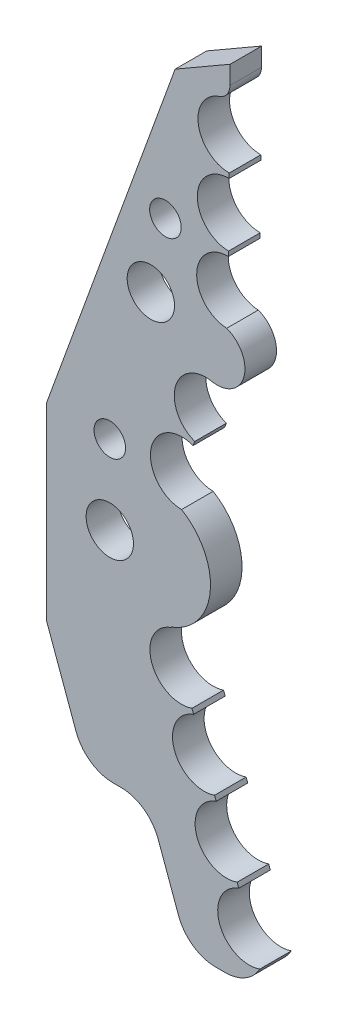
ISO-10303-21;
HEADER;
FILE_DESCRIPTION(('STEP AP214'),'2;1');
FILE_NAME('part.step','',(''),(''),'','','');
FILE_SCHEMA(('AUTOMOTIVE_DESIGN { 1 0 10303 214 1 1 1 1 }'));
ENDSEC;
DATA;
#1=APPLICATION_CONTEXT('core data for automotive mechanical design processes');
#2=APPLICATION_PROTOCOL_DEFINITION('international standard','automotive_design',2000,#1);
#3=PRODUCT_CONTEXT('',#1,'mechanical');
#4=PRODUCT('Part','Part','',(#3));
#5=PRODUCT_RELATED_PRODUCT_CATEGORY('part','',(#4));
#6=PRODUCT_DEFINITION_FORMATION('','',#4);
#7=PRODUCT_DEFINITION_CONTEXT('part definition',#1,'design');
#8=PRODUCT_DEFINITION('design','',#6,#7);
#9=PRODUCT_DEFINITION_SHAPE('','',#8);
#10=(LENGTH_UNIT() NAMED_UNIT(*) SI_UNIT(.MILLI.,.METRE.));
#11=(NAMED_UNIT(*) PLANE_ANGLE_UNIT() SI_UNIT($,.RADIAN.));
#12=(NAMED_UNIT(*) SI_UNIT($,.STERADIAN.) SOLID_ANGLE_UNIT());
#13=UNCERTAINTY_MEASURE_WITH_UNIT(LENGTH_MEASURE(1.E-05),#10,'distance_accuracy_value','');
#14=(GEOMETRIC_REPRESENTATION_CONTEXT(3) GLOBAL_UNCERTAINTY_ASSIGNED_CONTEXT((#13)) GLOBAL_UNIT_ASSIGNED_CONTEXT((#10,
#11,#12)) REPRESENTATION_CONTEXT('',''));
#15=CARTESIAN_POINT('',(0.,0.,0.));
#16=DIRECTION('',(0.,0.,1.));
#17=DIRECTION('',(1.,0.,0.));
#18=AXIS2_PLACEMENT_3D('',#15,#16,#17);
#19=CARTESIAN_POINT('',(7.1643416681253,2.52993402332491,2.));
#20=DIRECTION('',(0.942934851717221,0.332977274625494,0.));
#21=DIRECTION('',(-0.332977274625494,0.942934851717222,0.));
#22=AXIS2_PLACEMENT_3D('',#19,#20,#21);
#23=PLANE('',#22);
#24=DIRECTION('',(0.332977274625494,-0.942934851717222,0.));
#25=VECTOR('',#24,1.);
#26=CARTESIAN_POINT('',(7.1643416681253,2.52993402332491,0.));
#27=LINE('',#26,#25);
#28=CARTESIAN_POINT('',(2.36085114668553,16.1325999339435,0.));
#29=VERTEX_POINT('',#28);
#30=CARTESIAN_POINT('',(2.36868007173347,16.1104297534485,0.));
#31=VERTEX_POINT('',#30);
#32=EDGE_CURVE('E244',#29,#31,#27,.T.);
#33=ORIENTED_EDGE('',*,*,#32,.F.);
#34=DIRECTION('',(0.,0.,-1.));
#35=VECTOR('',#34,1.);
#36=CARTESIAN_POINT('',(2.36085114668553,16.1325999339435,2.));
#37=LINE('',#36,#35);
#38=CARTESIAN_POINT('',(2.36085114668553,16.1325999339435,2.));
#39=VERTEX_POINT('',#38);
#40=EDGE_CURVE('E238',#39,#29,#37,.T.);
#41=ORIENTED_EDGE('',*,*,#40,.F.);
#42=DIRECTION('',(0.332977274625494,-0.942934851717222,0.));
#43=VECTOR('',#42,1.);
#44=CARTESIAN_POINT('',(7.1643416681253,2.52993402332491,2.));
#45=LINE('',#44,#43);
#46=CARTESIAN_POINT('',(2.36868007173347,16.1104297534485,2.));
#47=VERTEX_POINT('',#46);
#48=EDGE_CURVE('E241',#39,#47,#45,.T.);
#49=ORIENTED_EDGE('',*,*,#48,.T.);
#50=DIRECTION('',(0.,0.,-1.));
#51=VECTOR('',#50,1.);
#52=CARTESIAN_POINT('',(2.36868007173347,16.1104297534485,2.));
#53=LINE('',#52,#51);
#54=EDGE_CURVE('E293',#47,#31,#53,.T.);
#55=ORIENTED_EDGE('',*,*,#54,.T.);
#56=EDGE_LOOP('',(#33,#41,#49,#55));
#57=FACE_BOUND('',#56,.T.);
#58=ADVANCED_FACE('F35',(#57),#23,.T.);
#59=CARTESIAN_POINT('',(1.10669620090285,19.6841528414567,2.));
#60=DIRECTION('',(0.,0.,-1.));
#61=DIRECTION('',(-1.,0.,0.));
#62=AXIS2_PLACEMENT_3D('',#59,#60,#61);
#63=CYLINDRICAL_SURFACE('',#62,3.76648811001667);
#64=CARTESIAN_POINT('',(1.10669620090285,19.6841528414567,0.));
#65=DIRECTION('',(0.,0.,1.));
#66=DIRECTION('',(1.,0.,0.));
#67=AXIS2_PLACEMENT_3D('',#64,#65,#66);
#68=CIRCLE('',#67,3.76648811001667);
#69=CARTESIAN_POINT('',(3.04231819460435,22.915220804282,0.));
#70=VERTEX_POINT('',#69);
#71=EDGE_CURVE('E295',#29,#70,#68,.T.);
#72=ORIENTED_EDGE('',*,*,#71,.T.);
#73=DIRECTION('',(0.,0.,-1.));
#74=VECTOR('',#73,1.);
#75=CARTESIAN_POINT('',(3.04231819460435,22.915220804282,2.));
#76=LINE('',#75,#74);
#77=CARTESIAN_POINT('',(3.04231819460435,22.915220804282,2.));
#78=VERTEX_POINT('',#77);
#79=EDGE_CURVE('E249',#78,#70,#76,.T.);
#80=ORIENTED_EDGE('',*,*,#79,.F.);
#81=CARTESIAN_POINT('',(1.10669620090285,19.6841528414567,2.));
#82=DIRECTION('',(0.,0.,1.));
#83=DIRECTION('',(1.,0.,0.));
#84=AXIS2_PLACEMENT_3D('',#81,#82,#83);
#85=CIRCLE('',#84,3.76648811001667);
#86=EDGE_CURVE('E252',#39,#78,#85,.T.);
#87=ORIENTED_EDGE('',*,*,#86,.F.);
#88=ORIENTED_EDGE('',*,*,#40,.T.);
#89=EDGE_LOOP('',(#72,#80,#87,#88));
#90=FACE_BOUND('',#89,.T.);
#91=ADVANCED_FACE('F253',(#90),#63,.T.);
#92=CARTESIAN_POINT('',(3.06770011836547,24.9150597372829,2.));
#93=DIRECTION('',(0.,0.,-1.));
#94=DIRECTION('',(-1.,0.,0.));
#95=AXIS2_PLACEMENT_3D('',#92,#93,#94);
#96=CYLINDRICAL_SURFACE('',#95,2.);
#97=CARTESIAN_POINT('',(3.06770011836547,24.9150597372829,0.));
#98=DIRECTION('',(0.,0.,1.));
#99=DIRECTION('',(1.,0.,0.));
#100=AXIS2_PLACEMENT_3D('',#97,#98,#99);
#101=CIRCLE('',#100,2.);
#102=CARTESIAN_POINT('',(3.76976301539283,26.7877870769182,0.));
#103=VERTEX_POINT('',#102);
#104=EDGE_CURVE('E299',#103,#70,#101,.T.);
#105=ORIENTED_EDGE('',*,*,#104,.F.);
#106=DIRECTION('',(0.,0.,-1.));
#107=VECTOR('',#106,1.);
#108=CARTESIAN_POINT('',(3.76976301539283,26.7877870769182,2.));
#109=LINE('',#108,#107);
#110=CARTESIAN_POINT('',(3.76976301539283,26.7877870769182,2.));
#111=VERTEX_POINT('',#110);
#112=EDGE_CURVE('E394',#111,#103,#109,.T.);
#113=ORIENTED_EDGE('',*,*,#112,.F.);
#114=CARTESIAN_POINT('',(3.06770011836547,24.9150597372829,2.));
#115=DIRECTION('',(0.,0.,1.));
#116=DIRECTION('',(1.,0.,0.));
#117=AXIS2_PLACEMENT_3D('',#114,#115,#116);
#118=CIRCLE('',#117,2.);
#119=EDGE_CURVE('E256',#111,#78,#118,.T.);
#120=ORIENTED_EDGE('',*,*,#119,.T.);
#121=ORIENTED_EDGE('',*,*,#79,.T.);
#122=EDGE_LOOP('',(#105,#113,#120,#121));
#123=FACE_BOUND('',#122,.T.);
#124=ADVANCED_FACE('F485',(#123),#96,.F.);
#125=CARTESIAN_POINT('',(-5.49971943804643,2.0617784980191,2.));
#126=DIRECTION('',(0.936363669817654,-0.351031448513684,0.));
#127=DIRECTION('',(0.351031448513684,0.936363669817654,0.));
#128=AXIS2_PLACEMENT_3D('',#125,#126,#127);
#129=PLANE('',#128);
#130=DIRECTION('',(-0.351031448513684,-0.936363669817654,0.));
#131=VECTOR('',#130,1.);
#132=CARTESIAN_POINT('',(-5.49971943804643,2.0617784980191,0.));
#133=LINE('',#132,#131);
#134=CARTESIAN_POINT('',(3.87507244994693,27.0686961778635,0.));
#135=VERTEX_POINT('',#134);
#136=EDGE_CURVE('E302',#135,#103,#133,.T.);
#137=ORIENTED_EDGE('',*,*,#136,.F.);
#138=DIRECTION('',(0.,0.,-1.));
#139=VECTOR('',#138,1.);
#140=CARTESIAN_POINT('',(3.87507244994693,27.0686961778635,2.));
#141=LINE('',#140,#139);
#142=CARTESIAN_POINT('',(3.87507244994693,27.0686961778635,2.));
#143=VERTEX_POINT('',#142);
#144=EDGE_CURVE('E392',#143,#135,#141,.T.);
#145=ORIENTED_EDGE('',*,*,#144,.F.);
#146=DIRECTION('',(-0.351031448513684,-0.936363669817654,0.));
#147=VECTOR('',#146,1.);
#148=CARTESIAN_POINT('',(-5.49971943804643,2.0617784980191,2.));
#149=LINE('',#148,#147);
#150=EDGE_CURVE('E480',#143,#111,#149,.T.);
#151=ORIENTED_EDGE('',*,*,#150,.T.);
#152=ORIENTED_EDGE('',*,*,#112,.T.);
#153=EDGE_LOOP('',(#137,#145,#151,#152));
#154=FACE_BOUND('',#153,.T.);
#155=ADVANCED_FACE('F490',(#154),#129,.T.);
#156=CARTESIAN_POINT('',(4.5771353469743,28.9414235174989,2.));
#157=DIRECTION('',(0.,0.,-1.));
#158=DIRECTION('',(-1.,0.,0.));
#159=AXIS2_PLACEMENT_3D('',#156,#157,#158);
#160=CYLINDRICAL_SURFACE('',#159,2.);
#161=CARTESIAN_POINT('',(4.5771353469743,28.9414235174989,0.));
#162=DIRECTION('',(0.,0.,1.));
#163=DIRECTION('',(1.,0.,0.));
#164=AXIS2_PLACEMENT_3D('',#161,#162,#163);
#165=CIRCLE('',#164,2.);
#166=CARTESIAN_POINT('',(5.03857278797506,30.8874644954956,0.));
#167=VERTEX_POINT('',#166);
#168=EDGE_CURVE('E305',#167,#135,#165,.T.);
#169=ORIENTED_EDGE('',*,*,#168,.F.);
#170=DIRECTION('',(0.,0.,-1.));
#171=VECTOR('',#170,1.);
#172=CARTESIAN_POINT('',(5.03857278797506,30.8874644954956,2.));
#173=LINE('',#172,#171);
#174=CARTESIAN_POINT('',(5.03857278797506,30.8874644954956,2.));
#175=VERTEX_POINT('',#174);
#176=EDGE_CURVE('E390',#175,#167,#173,.T.);
#177=ORIENTED_EDGE('',*,*,#176,.F.);
#178=CARTESIAN_POINT('',(4.5771353469743,28.9414235174989,2.));
#179=DIRECTION('',(0.,0.,1.));
#180=DIRECTION('',(1.,0.,0.));
#181=AXIS2_PLACEMENT_3D('',#178,#179,#180);
#182=CIRCLE('',#181,2.);
#183=EDGE_CURVE('E477',#175,#143,#182,.T.);
#184=ORIENTED_EDGE('',*,*,#183,.T.);
#185=ORIENTED_EDGE('',*,*,#144,.T.);
#186=EDGE_LOOP('',(#169,#177,#184,#185));
#187=FACE_BOUND('',#186,.T.);
#188=ADVANCED_FACE('F493',(#187),#160,.F.);
#189=CARTESIAN_POINT('',(5.28927199445633,32.6355237547983,2.));
#190=DIRECTION('',(0.,0.,-1.));
#191=DIRECTION('',(-1.,0.,0.));
#192=AXIS2_PLACEMENT_3D('',#189,#190,#191);
#193=CYLINDRICAL_SURFACE('',#192,1.76594486498426);
#194=CARTESIAN_POINT('',(5.28927199445633,32.6355237547983,0.));
#195=DIRECTION('',(0.,0.,1.));
#196=DIRECTION('',(1.,0.,0.));
#197=AXIS2_PLACEMENT_3D('',#194,#195,#196);
#198=CIRCLE('',#197,1.76594486498426);
#199=CARTESIAN_POINT('',(5.90133808483009,34.2920068869729,0.));
#200=VERTEX_POINT('',#199);
#201=EDGE_CURVE('E308',#167,#200,#198,.T.);
#202=ORIENTED_EDGE('',*,*,#201,.T.);
#203=DIRECTION('',(0.,0.,-1.));
#204=VECTOR('',#203,1.);
#205=CARTESIAN_POINT('',(5.90133808483009,34.2920068869729,2.));
#206=LINE('',#205,#204);
#207=CARTESIAN_POINT('',(5.90133808483009,34.2920068869729,2.));
#208=VERTEX_POINT('',#207);
#209=EDGE_CURVE('E388',#208,#200,#206,.T.);
#210=ORIENTED_EDGE('',*,*,#209,.F.);
#211=CARTESIAN_POINT('',(5.28927199445633,32.6355237547983,2.));
#212=DIRECTION('',(0.,0.,1.));
#213=DIRECTION('',(1.,0.,0.));
#214=AXIS2_PLACEMENT_3D('',#211,#212,#213);
#215=CIRCLE('',#214,1.76594486498426);
#216=EDGE_CURVE('E475',#175,#208,#215,.T.);
#217=ORIENTED_EDGE('',*,*,#216,.F.);
#218=ORIENTED_EDGE('',*,*,#176,.T.);
#219=EDGE_LOOP('',(#202,#210,#217,#218));
#220=FACE_BOUND('',#219,.T.);
#221=ADVANCED_FACE('F499',(#220),#193,.T.);
#222=CARTESIAN_POINT('',(5.99711428906432,36.2897123003666,2.));
#223=DIRECTION('',(0.,0.,-1.));
#224=DIRECTION('',(-1.,0.,0.));
#225=AXIS2_PLACEMENT_3D('',#222,#223,#224);
#226=CYLINDRICAL_SURFACE('',#225,2.);
#227=CARTESIAN_POINT('',(5.99711428906432,36.2897123003666,0.));
#228=DIRECTION('',(0.,0.,1.));
#229=DIRECTION('',(1.,0.,0.));
#230=AXIS2_PLACEMENT_3D('',#227,#228,#229);
#231=CIRCLE('',#230,2.);
#232=CARTESIAN_POINT('',(6.01632713961654,38.2896200148309,0.));
#233=VERTEX_POINT('',#232);
#234=EDGE_CURVE('E311',#233,#200,#231,.T.);
#235=ORIENTED_EDGE('',*,*,#234,.F.);
#236=DIRECTION('',(0.,0.,-1.));
#237=VECTOR('',#236,1.);
#238=CARTESIAN_POINT('',(6.01632713961654,38.2896200148309,2.));
#239=LINE('',#238,#237);
#240=CARTESIAN_POINT('',(6.01632713961654,38.2896200148309,2.));
#241=VERTEX_POINT('',#240);
#242=EDGE_CURVE('E386',#241,#233,#239,.T.);
#243=ORIENTED_EDGE('',*,*,#242,.F.);
#244=CARTESIAN_POINT('',(5.99711428906432,36.2897123003666,2.));
#245=DIRECTION('',(0.,0.,1.));
#246=DIRECTION('',(1.,0.,0.));
#247=AXIS2_PLACEMENT_3D('',#244,#245,#246);
#248=CIRCLE('',#247,2.);
#249=EDGE_CURVE('E472',#241,#208,#248,.T.);
#250=ORIENTED_EDGE('',*,*,#249,.T.);
#251=ORIENTED_EDGE('',*,*,#209,.T.);
#252=EDGE_LOOP('',(#235,#243,#250,#251));
#253=FACE_BOUND('',#252,.T.);
#254=ADVANCED_FACE('F503',(#253),#226,.F.);
#255=CARTESIAN_POINT('',(5.64796253145671,-0.0542592336919483,2.));
#256=DIRECTION('',(0.99995385723213,-0.00960642527611271,0.));
#257=DIRECTION('',(0.00960642527611271,0.99995385723213,0.));
#258=AXIS2_PLACEMENT_3D('',#255,#256,#257);
#259=PLANE('',#258);
#260=DIRECTION('',(-0.00960642527611271,-0.99995385723213,0.));
#261=VECTOR('',#260,1.);
#262=CARTESIAN_POINT('',(5.64796253145671,-0.0542592336919483,0.));
#263=LINE('',#262,#261);
#264=CARTESIAN_POINT('',(6.01921097333565,38.5898045859023,0.));
#265=VERTEX_POINT('',#264);
#266=EDGE_CURVE('E314',#265,#233,#263,.T.);
#267=ORIENTED_EDGE('',*,*,#266,.F.);
#268=DIRECTION('',(0.,0.,-1.));
#269=VECTOR('',#268,1.);
#270=CARTESIAN_POINT('',(6.01921097333565,38.5898045859023,2.));
#271=LINE('',#270,#269);
#272=CARTESIAN_POINT('',(6.01921097333565,38.5898045859023,2.));
#273=VERTEX_POINT('',#272);
#274=EDGE_CURVE('E384',#273,#265,#271,.T.);
#275=ORIENTED_EDGE('',*,*,#274,.F.);
#276=DIRECTION('',(-0.00960642527611271,-0.99995385723213,0.));
#277=VECTOR('',#276,1.);
#278=CARTESIAN_POINT('',(5.64796253145671,-0.0542592336919483,2.));
#279=LINE('',#278,#277);
#280=EDGE_CURVE('E469',#273,#241,#279,.T.);
#281=ORIENTED_EDGE('',*,*,#280,.T.);
#282=ORIENTED_EDGE('',*,*,#242,.T.);
#283=EDGE_LOOP('',(#267,#275,#281,#282));
#284=FACE_BOUND('',#283,.T.);
#285=ADVANCED_FACE('F506',(#284),#259,.T.);
#286=CARTESIAN_POINT('',(6.03842382388788,40.5897123003666,2.));
#287=DIRECTION('',(0.,0.,-1.));
#288=DIRECTION('',(-1.,0.,0.));
#289=AXIS2_PLACEMENT_3D('',#286,#287,#288);
#290=CYLINDRICAL_SURFACE('',#289,2.);
#291=CARTESIAN_POINT('',(6.03842382388788,40.5897123003666,0.));
#292=DIRECTION('',(0.,0.,1.));
#293=DIRECTION('',(1.,0.,0.));
#294=AXIS2_PLACEMENT_3D('',#291,#292,#293);
#295=CIRCLE('',#294,2.);
#296=CARTESIAN_POINT('',(6.0576366744401,42.5896200148309,0.));
#297=VERTEX_POINT('',#296);
#298=EDGE_CURVE('E317',#297,#265,#295,.T.);
#299=ORIENTED_EDGE('',*,*,#298,.F.);
#300=DIRECTION('',(0.,0.,-1.));
#301=VECTOR('',#300,1.);
#302=CARTESIAN_POINT('',(6.0576366744401,42.5896200148309,2.));
#303=LINE('',#302,#301);
#304=CARTESIAN_POINT('',(6.0576366744401,42.5896200148309,2.));
#305=VERTEX_POINT('',#304);
#306=EDGE_CURVE('E382',#305,#297,#303,.T.);
#307=ORIENTED_EDGE('',*,*,#306,.F.);
#308=CARTESIAN_POINT('',(6.03842382388788,40.5897123003666,2.));
#309=DIRECTION('',(0.,0.,1.));
#310=DIRECTION('',(1.,0.,0.));
#311=AXIS2_PLACEMENT_3D('',#308,#309,#310);
#312=CIRCLE('',#311,2.);
#313=EDGE_CURVE('E466',#305,#273,#312,.T.);
#314=ORIENTED_EDGE('',*,*,#313,.T.);
#315=ORIENTED_EDGE('',*,*,#274,.T.);
#316=EDGE_LOOP('',(#299,#307,#314,#315));
#317=FACE_BOUND('',#316,.T.);
#318=ADVANCED_FACE('F512',(#317),#290,.F.);
#319=CARTESIAN_POINT('',(6.06052050815921,42.8898045859023,0.));
#320=VERTEX_POINT('',#319);
#321=EDGE_CURVE('E319',#320,#297,#263,.T.);
#322=ORIENTED_EDGE('',*,*,#321,.F.);
#323=DIRECTION('',(0.,0.,-1.));
#324=VECTOR('',#323,1.);
#325=CARTESIAN_POINT('',(6.06052050815921,42.8898045859023,2.));
#326=LINE('',#325,#324);
#327=CARTESIAN_POINT('',(6.06052050815921,42.8898045859023,2.));
#328=VERTEX_POINT('',#327);
#329=EDGE_CURVE('E379',#328,#320,#326,.T.);
#330=ORIENTED_EDGE('',*,*,#329,.F.);
#331=EDGE_CURVE('E465',#328,#305,#279,.T.);
#332=ORIENTED_EDGE('',*,*,#331,.T.);
#333=ORIENTED_EDGE('',*,*,#306,.T.);
#334=EDGE_LOOP('',(#322,#330,#332,#333));
#335=FACE_BOUND('',#334,.T.);
#336=ADVANCED_FACE('F516',(#335),#259,.T.);
#337=CARTESIAN_POINT('',(6.07973335871144,44.8897123003666,2.));
#338=DIRECTION('',(0.,0.,-1.));
#339=DIRECTION('',(-1.,0.,0.));
#340=AXIS2_PLACEMENT_3D('',#337,#338,#339);
#341=CYLINDRICAL_SURFACE('',#340,2.);
#342=CARTESIAN_POINT('',(6.07973335871144,44.8897123003666,0.));
#343=DIRECTION('',(0.,0.,1.));
#344=DIRECTION('',(1.,0.,0.));
#345=AXIS2_PLACEMENT_3D('',#342,#343,#344);
#346=CIRCLE('',#345,2.);
#347=CARTESIAN_POINT('',(5.43121150310522,46.7816476594106,0.));
#348=VERTEX_POINT('',#347);
#349=EDGE_CURVE('E322',#348,#320,#346,.T.);
#350=ORIENTED_EDGE('',*,*,#349,.F.);
#351=DIRECTION('',(0.,0.,-1.));
#352=VECTOR('',#351,1.);
#353=CARTESIAN_POINT('',(5.43121150310522,46.7816476594106,2.));
#354=LINE('',#353,#352);
#355=CARTESIAN_POINT('',(5.43121150310522,46.7816476594106,2.));
#356=VERTEX_POINT('',#355);
#357=EDGE_CURVE('E401',#348,#356,#354,.F.);
#358=ORIENTED_EDGE('',*,*,#357,.T.);
#359=CARTESIAN_POINT('',(6.07973335871144,44.8897123003666,2.));
#360=DIRECTION('',(0.,0.,1.));
#361=DIRECTION('',(1.,0.,0.));
#362=AXIS2_PLACEMENT_3D('',#359,#360,#361);
#363=CIRCLE('',#362,2.);
#364=EDGE_CURVE('E463',#356,#328,#363,.T.);
#365=ORIENTED_EDGE('',*,*,#364,.T.);
#366=ORIENTED_EDGE('',*,*,#329,.T.);
#367=EDGE_LOOP('',(#350,#358,#365,#366));
#368=FACE_BOUND('',#367,.T.);
#369=ADVANCED_FACE('F533',(#368),#341,.F.);
#370=CARTESIAN_POINT('',(6.11815905981589,48.8895277292951,2.));
#371=VERTEX_POINT('',#370);
#372=CARTESIAN_POINT('',(6.10690443253424,47.7180089136565,2.));
#373=VERTEX_POINT('',#372);
#374=EDGE_CURVE('E462',#371,#373,#279,.T.);
#375=ORIENTED_EDGE('',*,*,#374,.T.);
#376=DIRECTION('',(0.,0.,-1.));
#377=VECTOR('',#376,1.);
#378=CARTESIAN_POINT('',(6.10690443253424,47.7180089136565,2.));
#379=LINE('',#378,#377);
#380=CARTESIAN_POINT('',(6.10690443253424,47.7180089136565,0.));
#381=VERTEX_POINT('',#380);
#382=EDGE_CURVE('E248',#373,#381,#379,.T.);
#383=ORIENTED_EDGE('',*,*,#382,.T.);
#384=CARTESIAN_POINT('',(6.11815905981589,48.8895277292951,0.));
#385=VERTEX_POINT('',#384);
#386=EDGE_CURVE('E318',#385,#381,#263,.T.);
#387=ORIENTED_EDGE('',*,*,#386,.F.);
#388=DIRECTION('',(0.,0.,-1.));
#389=VECTOR('',#388,1.);
#390=CARTESIAN_POINT('',(6.11815905981589,48.8895277292951,2.));
#391=LINE('',#390,#389);
#392=EDGE_CURVE('E377',#371,#385,#391,.T.);
#393=ORIENTED_EDGE('',*,*,#392,.F.);
#394=EDGE_LOOP('',(#375,#383,#387,#393));
#395=FACE_BOUND('',#394,.T.);
#396=ADVANCED_FACE('F523',(#395),#259,.T.);
#397=CARTESIAN_POINT('',(-19.6402467313427,34.0179052118742,2.));
#398=DIRECTION('',(-0.499999999999999,0.866025403784439,0.));
#399=DIRECTION('',(-0.866025403784439,-0.499999999999999,0.));
#400=AXIS2_PLACEMENT_3D('',#397,#398,#399);
#401=PLANE('',#400);
#402=DIRECTION('',(0.866025403784439,0.499999999999999,0.));
#403=VECTOR('',#402,1.);
#404=CARTESIAN_POINT('',(-19.6402467313427,34.0179052118742,0.));
#405=LINE('',#404,#403);
#406=CARTESIAN_POINT('',(2.6319808217236,46.8767817850895,0.));
#407=VERTEX_POINT('',#406);
#408=EDGE_CURVE('E324',#407,#385,#405,.T.);
#409=ORIENTED_EDGE('',*,*,#408,.F.);
#410=DIRECTION('',(0.,0.,-1.));
#411=VECTOR('',#410,1.);
#412=CARTESIAN_POINT('',(2.6319808217236,46.8767817850895,2.));
#413=LINE('',#412,#411);
#414=CARTESIAN_POINT('',(2.6319808217236,46.8767817850895,2.));
#415=VERTEX_POINT('',#414);
#416=EDGE_CURVE('E375',#415,#407,#413,.T.);
#417=ORIENTED_EDGE('',*,*,#416,.F.);
#418=DIRECTION('',(0.866025403784439,0.499999999999999,0.));
#419=VECTOR('',#418,1.);
#420=CARTESIAN_POINT('',(-19.6402467313427,34.0179052118742,2.));
#421=LINE('',#420,#419);
#422=EDGE_CURVE('E459',#415,#371,#421,.T.);
#423=ORIENTED_EDGE('',*,*,#422,.T.);
#424=ORIENTED_EDGE('',*,*,#392,.T.);
#425=EDGE_LOOP('',(#409,#417,#423,#424));
#426=FACE_BOUND('',#425,.T.);
#427=ADVANCED_FACE('F540',(#426),#401,.T.);
#428=CARTESIAN_POINT('',(-12.7418097044173,4.63763946309215,2.));
#429=DIRECTION('',(-0.939692620785908,0.34202014332567,0.));
#430=DIRECTION('',(-0.34202014332567,-0.939692620785908,0.));
#431=AXIS2_PLACEMENT_3D('',#428,#429,#430);
#432=PLANE('',#431);
#433=DIRECTION('',(0.34202014332567,0.939692620785908,0.));
#434=VECTOR('',#433,1.);
#435=CARTESIAN_POINT('',(-12.7418097044173,4.63763946309215,0.));
#436=LINE('',#435,#434);
#437=CARTESIAN_POINT('',(-5.50821759033678,24.5117704580733,0.));
#438=VERTEX_POINT('',#437);
#439=EDGE_CURVE('E327',#438,#407,#436,.T.);
#440=ORIENTED_EDGE('',*,*,#439,.F.);
#441=DIRECTION('',(0.,0.,-1.));
#442=VECTOR('',#441,1.);
#443=CARTESIAN_POINT('',(-5.50821759033678,24.5117704580733,2.));
#444=LINE('',#443,#442);
#445=CARTESIAN_POINT('',(-5.50821759033678,24.5117704580733,2.));
#446=VERTEX_POINT('',#445);
#447=EDGE_CURVE('E373',#446,#438,#444,.T.);
#448=ORIENTED_EDGE('',*,*,#447,.F.);
#449=DIRECTION('',(0.34202014332567,0.939692620785908,0.));
#450=VECTOR('',#449,1.);
#451=CARTESIAN_POINT('',(-12.7418097044173,4.63763946309215,2.));
#452=LINE('',#451,#450);
#453=EDGE_CURVE('E456',#446,#415,#452,.T.);
#454=ORIENTED_EDGE('',*,*,#453,.T.);
#455=ORIENTED_EDGE('',*,*,#416,.T.);
#456=EDGE_LOOP('',(#440,#448,#454,#455));
#457=FACE_BOUND('',#456,.T.);
#458=ADVANCED_FACE('F627',(#457),#432,.T.);
#459=CARTESIAN_POINT('',(-5.50821759033678,0.,2.));
#460=DIRECTION('',(-1.,0.,0.));
#461=DIRECTION('',(0.,0.,1.));
#462=AXIS2_PLACEMENT_3D('',#459,#460,#461);
#463=PLANE('',#462);
#464=DIRECTION('',(0.,1.,0.));
#465=VECTOR('',#464,1.);
#466=CARTESIAN_POINT('',(-5.50821759033678,0.,0.));
#467=LINE('',#466,#465);
#468=CARTESIAN_POINT('',(-5.50821759033678,12.5117704580733,0.));
#469=VERTEX_POINT('',#468);
#470=EDGE_CURVE('E330',#469,#438,#467,.T.);
#471=ORIENTED_EDGE('',*,*,#470,.F.);
#472=DIRECTION('',(0.,0.,-1.));
#473=VECTOR('',#472,1.);
#474=CARTESIAN_POINT('',(-5.50821759033678,12.5117704580733,2.));
#475=LINE('',#474,#473);
#476=CARTESIAN_POINT('',(-5.50821759033678,12.5117704580733,2.));
#477=VERTEX_POINT('',#476);
#478=EDGE_CURVE('E370',#477,#469,#475,.T.);
#479=ORIENTED_EDGE('',*,*,#478,.F.);
#480=DIRECTION('',(0.,1.,0.));
#481=VECTOR('',#480,1.);
#482=CARTESIAN_POINT('',(-5.50821759033678,0.,2.));
#483=LINE('',#482,#481);
#484=EDGE_CURVE('E453',#477,#446,#483,.T.);
#485=ORIENTED_EDGE('',*,*,#484,.T.);
#486=ORIENTED_EDGE('',*,*,#447,.T.);
#487=EDGE_LOOP('',(#471,#479,#485,#486));
#488=FACE_BOUND('',#487,.T.);
#489=ADVANCED_FACE('F631',(#488),#463,.T.);
#490=CARTESIAN_POINT('',(-0.842673020606462,-0.30670789671994,2.));
#491=DIRECTION('',(-0.939692620785909,-0.342020143325666,0.));
#492=DIRECTION('',(0.342020143325666,-0.939692620785909,0.));
#493=AXIS2_PLACEMENT_3D('',#490,#491,#492);
#494=PLANE('',#493);
#495=DIRECTION('',(-0.342020143325666,0.939692620785909,0.));
#496=VECTOR('',#495,1.);
#497=CARTESIAN_POINT('',(-0.842673020606462,-0.30670789671994,0.));
#498=LINE('',#497,#496);
#499=CARTESIAN_POINT('',(-3.64423996691245,7.39053402734628,0.));
#500=VERTEX_POINT('',#499);
#501=EDGE_CURVE('E333',#500,#469,#498,.T.);
#502=ORIENTED_EDGE('',*,*,#501,.F.);
#503=DIRECTION('',(0.,0.,-1.));
#504=VECTOR('',#503,1.);
#505=CARTESIAN_POINT('',(-3.64423996691245,7.39053402734628,2.));
#506=LINE('',#505,#504);
#507=CARTESIAN_POINT('',(-3.64423996691245,7.39053402734628,2.));
#508=VERTEX_POINT('',#507);
#509=EDGE_CURVE('E431',#500,#508,#506,.F.);
#510=ORIENTED_EDGE('',*,*,#509,.T.);
#511=DIRECTION('',(-0.342020143325666,0.939692620785909,0.));
#512=VECTOR('',#511,1.);
#513=CARTESIAN_POINT('',(-0.842673020606462,-0.30670789671994,2.));
#514=LINE('',#513,#512);
#515=EDGE_CURVE('E449',#508,#477,#514,.T.);
#516=ORIENTED_EDGE('',*,*,#515,.T.);
#517=ORIENTED_EDGE('',*,*,#478,.T.);
#518=EDGE_LOOP('',(#502,#510,#516,#517));
#519=FACE_BOUND('',#518,.T.);
#520=ADVANCED_FACE('F635',(#519),#494,.T.);
#521=CARTESIAN_POINT('',(0.,5.74558438566044,2.));
#522=DIRECTION('',(0.,-1.,0.));
#523=DIRECTION('',(1.,0.,0.));
#524=AXIS2_PLACEMENT_3D('',#521,#522,#523);
#525=PLANE('',#524);
#526=DIRECTION('',(-1.,0.,0.));
#527=VECTOR('',#526,1.);
#528=CARTESIAN_POINT('',(0.,5.74558438566044,0.));
#529=LINE('',#528,#527);
#530=CARTESIAN_POINT('',(-0.796046105996226,5.74558438566044,0.));
#531=VERTEX_POINT('',#530);
#532=CARTESIAN_POINT('',(-1.29500841494768,5.74558438566044,0.));
#533=VERTEX_POINT('',#532);
#534=EDGE_CURVE('E335',#531,#533,#529,.T.);
#535=ORIENTED_EDGE('',*,*,#534,.F.);
#536=DIRECTION('',(0.,0.,-1.));
#537=VECTOR('',#536,1.);
#538=CARTESIAN_POINT('',(-0.796046105996226,5.74558438566044,2.));
#539=LINE('',#538,#537);
#540=CARTESIAN_POINT('',(-0.796046105996226,5.74558438566044,2.));
#541=VERTEX_POINT('',#540);
#542=EDGE_CURVE('E429',#531,#541,#539,.F.);
#543=ORIENTED_EDGE('',*,*,#542,.T.);
#544=DIRECTION('',(-1.,0.,0.));
#545=VECTOR('',#544,1.);
#546=CARTESIAN_POINT('',(0.,5.74558438566044,2.));
#547=LINE('',#546,#545);
#548=CARTESIAN_POINT('',(-1.29500841494768,5.74558438566044,2.));
#549=VERTEX_POINT('',#548);
#550=EDGE_CURVE('E446',#541,#549,#547,.T.);
#551=ORIENTED_EDGE('',*,*,#550,.T.);
#552=DIRECTION('',(0.,0.,-1.));
#553=VECTOR('',#552,1.);
#554=CARTESIAN_POINT('',(-1.29500841494768,5.74558438566044,2.));
#555=LINE('',#554,#553);
#556=EDGE_CURVE('E426',#549,#533,#555,.T.);
#557=ORIENTED_EDGE('',*,*,#556,.T.);
#558=EDGE_LOOP('',(#535,#543,#551,#557));
#559=FACE_BOUND('',#558,.T.);
#560=ADVANCED_FACE('F439',(#559),#525,.T.);
#561=CARTESIAN_POINT('',(2.68941586563152,0.978867322653159,2.));
#562=DIRECTION('',(-0.939692620785907,-0.342020143325672,0.));
#563=DIRECTION('',(0.342020143325672,-0.939692620785907,0.));
#564=AXIS2_PLACEMENT_3D('',#561,#562,#563);
#565=PLANE('',#564);
#566=DIRECTION('',(-0.342020143325672,0.939692620785907,0.));
#567=VECTOR('',#566,1.);
#568=CARTESIAN_POINT('',(2.68941586563152,0.978867322653159,0.));
#569=LINE('',#568,#567);
#570=CARTESIAN_POINT('',(2.85116058044721,0.53447737098094,0.));
#571=VERTEX_POINT('',#570);
#572=CARTESIAN_POINT('',(1.55318544596854,4.10063474397462,0.));
#573=VERTEX_POINT('',#572);
#574=EDGE_CURVE('E338',#571,#573,#569,.T.);
#575=ORIENTED_EDGE('',*,*,#574,.F.);
#576=DIRECTION('',(0.,0.,-1.));
#577=VECTOR('',#576,1.);
#578=CARTESIAN_POINT('',(2.85116058044721,0.53447737098094,2.));
#579=LINE('',#578,#577);
#580=CARTESIAN_POINT('',(2.85116058044721,0.53447737098094,2.));
#581=VERTEX_POINT('',#580);
#582=EDGE_CURVE('E55',#571,#581,#579,.F.);
#583=ORIENTED_EDGE('',*,*,#582,.T.);
#584=DIRECTION('',(-0.342020143325672,0.939692620785907,0.));
#585=VECTOR('',#584,1.);
#586=CARTESIAN_POINT('',(2.68941586563152,0.978867322653159,2.));
#587=LINE('',#586,#585);
#588=CARTESIAN_POINT('',(1.55318544596854,4.10063474397462,2.));
#589=VERTEX_POINT('',#588);
#590=EDGE_CURVE('E444',#581,#589,#587,.T.);
#591=ORIENTED_EDGE('',*,*,#590,.T.);
#592=DIRECTION('',(0.,0.,-1.));
#593=VECTOR('',#592,1.);
#594=CARTESIAN_POINT('',(1.55318544596854,4.10063474397462,0.));
#595=LINE('',#594,#593);
#596=EDGE_CURVE('E422',#589,#573,#595,.T.);
#597=ORIENTED_EDGE('',*,*,#596,.T.);
#598=EDGE_LOOP('',(#575,#583,#591,#597));
#599=FACE_BOUND('',#598,.T.);
#600=ADVANCED_FACE('F443',(#599),#565,.T.);
#601=CARTESIAN_POINT('',(0.,-1.11047227070488,2.));
#602=DIRECTION('',(0.,1.,0.));
#603=DIRECTION('',(-1.,0.,0.));
#604=AXIS2_PLACEMENT_3D('',#601,#602,#603);
#605=PLANE('',#604);
#606=DIRECTION('',(1.,0.,0.));
#607=VECTOR('',#606,1.);
#608=CARTESIAN_POINT('',(0.,-1.11047227070488,0.));
#609=LINE('',#608,#607);
#610=CARTESIAN_POINT('',(5.20039213241198,-1.11047227070488,0.));
#611=VERTEX_POINT('',#610);
#612=CARTESIAN_POINT('',(5.8109305055581,-1.11047227070488,0.));
#613=VERTEX_POINT('',#612);
#614=EDGE_CURVE('E341',#611,#613,#609,.T.);
#615=ORIENTED_EDGE('',*,*,#614,.T.);
#616=DIRECTION('',(0.,0.,-1.));
#617=VECTOR('',#616,1.);
#618=CARTESIAN_POINT('',(5.8109305055581,-1.11047227070488,2.));
#619=LINE('',#618,#617);
#620=CARTESIAN_POINT('',(5.8109305055581,-1.11047227070488,2.));
#621=VERTEX_POINT('',#620);
#622=EDGE_CURVE('E414',#613,#621,#619,.F.);
#623=ORIENTED_EDGE('',*,*,#622,.T.);
#624=DIRECTION('',(1.,0.,0.));
#625=VECTOR('',#624,1.);
#626=CARTESIAN_POINT('',(0.,-1.11047227070488,2.));
#627=LINE('',#626,#625);
#628=CARTESIAN_POINT('',(5.20039213241198,-1.11047227070488,2.));
#629=VERTEX_POINT('',#628);
#630=EDGE_CURVE('E282',#629,#621,#627,.T.);
#631=ORIENTED_EDGE('',*,*,#630,.F.);
#632=DIRECTION('',(0.,0.,-1.));
#633=VECTOR('',#632,1.);
#634=CARTESIAN_POINT('',(5.20039213241198,-1.11047227070488,0.));
#635=LINE('',#634,#633);
#636=EDGE_CURVE('E411',#629,#611,#635,.T.);
#637=ORIENTED_EDGE('',*,*,#636,.T.);
#638=EDGE_LOOP('',(#615,#623,#631,#637));
#639=FACE_BOUND('',#638,.T.);
#640=ADVANCED_FACE('F592',(#639),#605,.F.);
#641=CARTESIAN_POINT('',(7.33004146365334,2.06070046286186,2.));
#642=DIRECTION('',(0.,0.,-1.));
#643=DIRECTION('',(-1.,0.,0.));
#644=AXIS2_PLACEMENT_3D('',#641,#642,#643);
#645=CYLINDRICAL_SURFACE('',#644,2.);
#646=CARTESIAN_POINT('',(7.33004146365334,2.06070046286186,0.));
#647=DIRECTION('',(0.,0.,1.));
#648=DIRECTION('',(1.,0.,0.));
#649=AXIS2_PLACEMENT_3D('',#646,#647,#648);
#650=CIRCLE('',#649,2.);
#651=CARTESIAN_POINT('',(6.66408691440235,3.9465701662963,0.));
#652=VERTEX_POINT('',#651);
#653=CARTESIAN_POINT('',(7.99599601290433,0.174830759427417,0.));
#654=VERTEX_POINT('',#653);
#655=EDGE_CURVE('E344',#652,#654,#650,.T.);
#656=ORIENTED_EDGE('',*,*,#655,.F.);
#657=DIRECTION('',(0.,0.,-1.));
#658=VECTOR('',#657,1.);
#659=CARTESIAN_POINT('',(6.66408691440235,3.9465701662963,2.));
#660=LINE('',#659,#658);
#661=CARTESIAN_POINT('',(6.66408691440235,3.9465701662963,2.));
#662=VERTEX_POINT('',#661);
#663=EDGE_CURVE('E365',#662,#652,#660,.T.);
#664=ORIENTED_EDGE('',*,*,#663,.F.);
#665=CARTESIAN_POINT('',(7.33004146365334,2.06070046286186,2.));
#666=DIRECTION('',(0.,0.,1.));
#667=DIRECTION('',(1.,0.,0.));
#668=AXIS2_PLACEMENT_3D('',#665,#666,#667);
#669=CIRCLE('',#668,2.);
#670=CARTESIAN_POINT('',(7.99599601290433,0.174830759427417,2.));
#671=VERTEX_POINT('',#670);
#672=EDGE_CURVE('E276',#662,#671,#669,.T.);
#673=ORIENTED_EDGE('',*,*,#672,.T.);
#674=DIRECTION('',(0.,0.,-1.));
#675=VECTOR('',#674,1.);
#676=CARTESIAN_POINT('',(7.99599601290433,0.174830759427417,2.));
#677=LINE('',#676,#675);
#678=EDGE_CURVE('E367',#671,#654,#677,.T.);
#679=ORIENTED_EDGE('',*,*,#678,.T.);
#680=EDGE_LOOP('',(#656,#664,#673,#679));
#681=FACE_BOUND('',#680,.T.);
#682=ADVANCED_FACE('F555',(#681),#645,.F.);
#683=CARTESIAN_POINT('',(6.5641937320147,4.22945062181147,0.));
#684=VERTEX_POINT('',#683);
#685=EDGE_CURVE('E297',#684,#652,#27,.T.);
#686=ORIENTED_EDGE('',*,*,#685,.F.);
#687=DIRECTION('',(0.,0.,-1.));
#688=VECTOR('',#687,1.);
#689=CARTESIAN_POINT('',(6.5641937320147,4.22945062181147,2.));
#690=LINE('',#689,#688);
#691=CARTESIAN_POINT('',(6.5641937320147,4.22945062181147,2.));
#692=VERTEX_POINT('',#691);
#693=EDGE_CURVE('E363',#692,#684,#690,.T.);
#694=ORIENTED_EDGE('',*,*,#693,.F.);
#695=EDGE_CURVE('E266',#692,#662,#45,.T.);
#696=ORIENTED_EDGE('',*,*,#695,.T.);
#697=ORIENTED_EDGE('',*,*,#663,.T.);
#698=EDGE_LOOP('',(#686,#694,#696,#697));
#699=FACE_BOUND('',#698,.T.);
#700=ADVANCED_FACE('F545',(#699),#23,.T.);
#701=CARTESIAN_POINT('',(5.89823918276372,6.11532032524591,2.));
#702=DIRECTION('',(0.,0.,-1.));
#703=DIRECTION('',(-1.,0.,0.));
#704=AXIS2_PLACEMENT_3D('',#701,#702,#703);
#705=CYLINDRICAL_SURFACE('',#704,2.);
#706=CARTESIAN_POINT('',(5.89823918276372,6.11532032524591,0.));
#707=DIRECTION('',(0.,0.,1.));
#708=DIRECTION('',(1.,0.,0.));
#709=AXIS2_PLACEMENT_3D('',#706,#707,#708);
#710=CIRCLE('',#709,2.);
#711=CARTESIAN_POINT('',(5.23228463351272,8.00119002868035,0.));
#712=VERTEX_POINT('',#711);
#713=EDGE_CURVE('E347',#712,#684,#710,.T.);
#714=ORIENTED_EDGE('',*,*,#713,.F.);
#715=DIRECTION('',(0.,0.,-1.));
#716=VECTOR('',#715,1.);
#717=CARTESIAN_POINT('',(5.23228463351272,8.00119002868035,2.));
#718=LINE('',#717,#716);
#719=CARTESIAN_POINT('',(5.23228463351272,8.00119002868035,2.));
#720=VERTEX_POINT('',#719);
#721=EDGE_CURVE('E361',#720,#712,#718,.T.);
#722=ORIENTED_EDGE('',*,*,#721,.F.);
#723=CARTESIAN_POINT('',(5.89823918276372,6.11532032524591,2.));
#724=DIRECTION('',(0.,0.,1.));
#725=DIRECTION('',(1.,0.,0.));
#726=AXIS2_PLACEMENT_3D('',#723,#724,#725);
#727=CIRCLE('',#726,2.);
#728=EDGE_CURVE('E275',#720,#692,#727,.T.);
#729=ORIENTED_EDGE('',*,*,#728,.T.);
#730=ORIENTED_EDGE('',*,*,#693,.T.);
#731=EDGE_LOOP('',(#714,#722,#729,#730));
#732=FACE_BOUND('',#731,.T.);
#733=ADVANCED_FACE('F554',(#732),#705,.F.);
#734=CARTESIAN_POINT('',(5.13239145112508,8.28407048419552,0.));
#735=VERTEX_POINT('',#734);
#736=EDGE_CURVE('E350',#735,#712,#27,.T.);
#737=ORIENTED_EDGE('',*,*,#736,.F.);
#738=DIRECTION('',(0.,0.,-1.));
#739=VECTOR('',#738,1.);
#740=CARTESIAN_POINT('',(5.13239145112508,8.28407048419552,2.));
#741=LINE('',#740,#739);
#742=CARTESIAN_POINT('',(5.13239145112508,8.28407048419552,2.));
#743=VERTEX_POINT('',#742);
#744=EDGE_CURVE('E359',#743,#735,#741,.T.);
#745=ORIENTED_EDGE('',*,*,#744,.F.);
#746=EDGE_CURVE('E273',#743,#720,#45,.T.);
#747=ORIENTED_EDGE('',*,*,#746,.T.);
#748=ORIENTED_EDGE('',*,*,#721,.T.);
#749=EDGE_LOOP('',(#737,#745,#747,#748));
#750=FACE_BOUND('',#749,.T.);
#751=ADVANCED_FACE('F556',(#750),#23,.T.);
#752=CARTESIAN_POINT('',(4.46643690187409,10.16994018763,2.));
#753=DIRECTION('',(0.,0.,-1.));
#754=DIRECTION('',(-1.,0.,0.));
#755=AXIS2_PLACEMENT_3D('',#752,#753,#754);
#756=CYLINDRICAL_SURFACE('',#755,2.);
#757=CARTESIAN_POINT('',(4.46643690187409,10.16994018763,0.));
#758=DIRECTION('',(0.,0.,1.));
#759=DIRECTION('',(1.,0.,0.));
#760=AXIS2_PLACEMENT_3D('',#757,#758,#759);
#761=CIRCLE('',#760,2.);
#762=CARTESIAN_POINT('',(3.8004823526231,12.0558098910644,0.));
#763=VERTEX_POINT('',#762);
#764=EDGE_CURVE('E351',#763,#735,#761,.T.);
#765=ORIENTED_EDGE('',*,*,#764,.F.);
#766=DIRECTION('',(0.,0.,-1.));
#767=VECTOR('',#766,1.);
#768=CARTESIAN_POINT('',(3.8004823526231,12.0558098910644,2.));
#769=LINE('',#768,#767);
#770=CARTESIAN_POINT('',(3.8004823526231,12.0558098910644,2.));
#771=VERTEX_POINT('',#770);
#772=EDGE_CURVE('E357',#771,#763,#769,.T.);
#773=ORIENTED_EDGE('',*,*,#772,.F.);
#774=CARTESIAN_POINT('',(4.46643690187409,10.16994018763,2.));
#775=DIRECTION('',(0.,0.,1.));
#776=DIRECTION('',(1.,0.,0.));
#777=AXIS2_PLACEMENT_3D('',#774,#775,#776);
#778=CIRCLE('',#777,2.);
#779=EDGE_CURVE('E272',#771,#743,#778,.T.);
#780=ORIENTED_EDGE('',*,*,#779,.T.);
#781=ORIENTED_EDGE('',*,*,#744,.T.);
#782=EDGE_LOOP('',(#765,#773,#780,#781));
#783=FACE_BOUND('',#782,.T.);
#784=ADVANCED_FACE('F559',(#783),#756,.F.);
#785=CARTESIAN_POINT('',(3.70058917023545,12.3386903465796,0.));
#786=VERTEX_POINT('',#785);
#787=EDGE_CURVE('E268',#786,#763,#27,.T.);
#788=ORIENTED_EDGE('',*,*,#787,.F.);
#789=DIRECTION('',(0.,0.,-1.));
#790=VECTOR('',#789,1.);
#791=CARTESIAN_POINT('',(3.70058917023545,12.3386903465796,2.));
#792=LINE('',#791,#790);
#793=CARTESIAN_POINT('',(3.70058917023545,12.3386903465796,2.));
#794=VERTEX_POINT('',#793);
#795=EDGE_CURVE('E355',#794,#786,#792,.T.);
#796=ORIENTED_EDGE('',*,*,#795,.F.);
#797=EDGE_CURVE('E265',#794,#771,#45,.T.);
#798=ORIENTED_EDGE('',*,*,#797,.T.);
#799=ORIENTED_EDGE('',*,*,#772,.T.);
#800=EDGE_LOOP('',(#788,#796,#798,#799));
#801=FACE_BOUND('',#800,.T.);
#802=ADVANCED_FACE('F546',(#801),#23,.T.);
#803=CARTESIAN_POINT('',(3.03463462098446,14.224560050014,2.));
#804=DIRECTION('',(0.,0.,-1.));
#805=DIRECTION('',(-1.,0.,0.));
#806=AXIS2_PLACEMENT_3D('',#803,#804,#805);
#807=CYLINDRICAL_SURFACE('',#806,2.);
#808=CARTESIAN_POINT('',(3.03463462098446,14.224560050014,0.));
#809=DIRECTION('',(0.,0.,1.));
#810=DIRECTION('',(1.,0.,0.));
#811=AXIS2_PLACEMENT_3D('',#808,#809,#810);
#812=CIRCLE('',#811,2.);
#813=EDGE_CURVE('E263',#31,#786,#812,.T.);
#814=ORIENTED_EDGE('',*,*,#813,.F.);
#815=ORIENTED_EDGE('',*,*,#54,.F.);
#816=CARTESIAN_POINT('',(3.03463462098446,14.224560050014,2.));
#817=DIRECTION('',(0.,0.,1.));
#818=DIRECTION('',(1.,0.,0.));
#819=AXIS2_PLACEMENT_3D('',#816,#817,#818);
#820=CIRCLE('',#819,2.);
#821=EDGE_CURVE('E262',#47,#794,#820,.T.);
#822=ORIENTED_EDGE('',*,*,#821,.T.);
#823=ORIENTED_EDGE('',*,*,#795,.T.);
#824=EDGE_LOOP('',(#814,#815,#822,#823));
#825=FACE_BOUND('',#824,.T.);
#826=ADVANCED_FACE('F558',(#825),#807,.F.);
#827=CARTESIAN_POINT('',(0.,0.,2.));
#828=DIRECTION('',(0.,0.,1.));
#829=DIRECTION('',(1.,0.,0.));
#830=AXIS2_PLACEMENT_3D('',#827,#828,#829);
#831=PLANE('',#830);
#832=CARTESIAN_POINT('',(1.09290109369069,33.8767817850895,2.));
#833=DIRECTION('',(0.,0.,1.));
#834=DIRECTION('',(1.,0.,0.));
#835=AXIS2_PLACEMENT_3D('',#832,#833,#834);
#836=CIRCLE('',#835,1.5);
#837=CARTESIAN_POINT('',(2.5929010936907,33.8767817850895,2.));
#838=VERTEX_POINT('',#837);
#839=EDGE_CURVE('E914',#838,#838,#836,.T.);
#840=ORIENTED_EDGE('',*,*,#839,.F.);
#841=EDGE_LOOP('',(#840));
#842=FACE_BOUND('',#841,.T.);
#843=CARTESIAN_POINT('',(-1.50821759033678,19.5117704580733,2.));
#844=DIRECTION('',(0.,0.,1.));
#845=DIRECTION('',(1.,0.,0.));
#846=AXIS2_PLACEMENT_3D('',#843,#844,#845);
#847=CIRCLE('',#846,1.5);
#848=CARTESIAN_POINT('',(-0.00821759033677537,19.5117704580733,2.));
#849=VERTEX_POINT('',#848);
#850=EDGE_CURVE('E918',#849,#849,#847,.T.);
#851=ORIENTED_EDGE('',*,*,#850,.F.);
#852=EDGE_LOOP('',(#851));
#853=FACE_BOUND('',#852,.T.);
#854=CARTESIAN_POINT('',(-1.50821759033678,24.5117704580733,2.));
#855=DIRECTION('',(0.,0.,1.));
#856=DIRECTION('',(1.,0.,0.));
#857=AXIS2_PLACEMENT_3D('',#854,#855,#856);
#858=CIRCLE('',#857,1.);
#859=CARTESIAN_POINT('',(-0.508217590336776,24.5117704580733,2.));
#860=VERTEX_POINT('',#859);
#861=EDGE_CURVE('E922',#860,#860,#858,.T.);
#862=ORIENTED_EDGE('',*,*,#861,.F.);
#863=EDGE_LOOP('',(#862));
#864=FACE_BOUND('',#863,.T.);
#865=CARTESIAN_POINT('',(2.01697991169869,38.3767817850895,2.));
#866=DIRECTION('',(0.,0.,1.));
#867=DIRECTION('',(1.,0.,0.));
#868=AXIS2_PLACEMENT_3D('',#865,#866,#867);
#869=CIRCLE('',#868,1.);
#870=CARTESIAN_POINT('',(3.01697991169869,38.3767817850895,2.));
#871=VERTEX_POINT('',#870);
#872=EDGE_CURVE('E925',#871,#871,#869,.T.);
#873=ORIENTED_EDGE('',*,*,#872,.F.);
#874=EDGE_LOOP('',(#873));
#875=FACE_BOUND('',#874,.T.);
#876=ORIENTED_EDGE('',*,*,#630,.T.);
#877=CARTESIAN_POINT('',(5.8109305055581,1.38952772929512,2.));
#878=DIRECTION('',(0.,0.,1.));
#879=DIRECTION('',(1.,0.,0.));
#880=AXIS2_PLACEMENT_3D('',#877,#878,#879);
#881=CIRCLE('',#880,2.5);
#882=EDGE_CURVE('E420',#621,#671,#881,.T.);
#883=ORIENTED_EDGE('',*,*,#882,.T.);
#884=ORIENTED_EDGE('',*,*,#672,.F.);
#885=ORIENTED_EDGE('',*,*,#695,.F.);
#886=ORIENTED_EDGE('',*,*,#728,.F.);
#887=ORIENTED_EDGE('',*,*,#746,.F.);
#888=ORIENTED_EDGE('',*,*,#779,.F.);
#889=ORIENTED_EDGE('',*,*,#797,.F.);
#890=ORIENTED_EDGE('',*,*,#821,.F.);
#891=ORIENTED_EDGE('',*,*,#48,.F.);
#892=ORIENTED_EDGE('',*,*,#86,.T.);
#893=ORIENTED_EDGE('',*,*,#119,.F.);
#894=ORIENTED_EDGE('',*,*,#150,.F.);
#895=ORIENTED_EDGE('',*,*,#183,.F.);
#896=ORIENTED_EDGE('',*,*,#216,.T.);
#897=ORIENTED_EDGE('',*,*,#249,.F.);
#898=ORIENTED_EDGE('',*,*,#280,.F.);
#899=ORIENTED_EDGE('',*,*,#313,.F.);
#900=ORIENTED_EDGE('',*,*,#331,.F.);
#901=ORIENTED_EDGE('',*,*,#364,.F.);
#902=CARTESIAN_POINT('',(5.10695057530211,47.7276153389326,2.));
#903=DIRECTION('',(0.,0.,1.));
#904=DIRECTION('',(1.,0.,0.));
#905=AXIS2_PLACEMENT_3D('',#902,#903,#904);
#906=CIRCLE('',#905,1.);
#907=EDGE_CURVE('E403',#356,#373,#906,.T.);
#908=ORIENTED_EDGE('',*,*,#907,.T.);
#909=ORIENTED_EDGE('',*,*,#374,.F.);
#910=ORIENTED_EDGE('',*,*,#422,.F.);
#911=ORIENTED_EDGE('',*,*,#453,.F.);
#912=ORIENTED_EDGE('',*,*,#484,.F.);
#913=ORIENTED_EDGE('',*,*,#515,.F.);
#914=CARTESIAN_POINT('',(-1.29500841494768,8.24558438566044,2.));
#915=DIRECTION('',(0.,0.,1.));
#916=DIRECTION('',(1.,0.,0.));
#917=AXIS2_PLACEMENT_3D('',#914,#915,#916);
#918=CIRCLE('',#917,2.5);
#919=EDGE_CURVE('E416',#508,#549,#918,.T.);
#920=ORIENTED_EDGE('',*,*,#919,.T.);
#921=ORIENTED_EDGE('',*,*,#550,.F.);
#922=CARTESIAN_POINT('',(-0.796046105996227,3.24558438566044,2.));
#923=DIRECTION('',(0.,0.,1.));
#924=DIRECTION('',(1.,0.,0.));
#925=AXIS2_PLACEMENT_3D('',#922,#923,#924);
#926=CIRCLE('',#925,2.5);
#927=EDGE_CURVE('E11',#541,#589,#926,.F.);
#928=ORIENTED_EDGE('',*,*,#927,.T.);
#929=ORIENTED_EDGE('',*,*,#590,.F.);
#930=CARTESIAN_POINT('',(5.20039213241198,1.38952772929512,2.));
#931=DIRECTION('',(0.,0.,1.));
#932=DIRECTION('',(1.,0.,0.));
#933=AXIS2_PLACEMENT_3D('',#930,#931,#932);
#934=CIRCLE('',#933,2.5);
#935=EDGE_CURVE('E418',#581,#629,#934,.T.);
#936=ORIENTED_EDGE('',*,*,#935,.T.);
#937=EDGE_LOOP('',(#876,#883,#884,#885,#886,#887,#888,#889,#890,#891,#892,#893,#894,#895,#896,
#897,#898,#899,#900,#901,#908,#909,#910,#911,#912,#913,#920,#921,#928,#929,#936));
#938=FACE_BOUND('',#937,.T.);
#939=ADVANCED_FACE('F259',(#842,#853,#864,#875,#938),#831,.T.);
#940=CARTESIAN_POINT('',(0.,0.,0.));
#941=DIRECTION('',(0.,0.,1.));
#942=DIRECTION('',(1.,0.,0.));
#943=AXIS2_PLACEMENT_3D('',#940,#941,#942);
#944=PLANE('',#943);
#945=CARTESIAN_POINT('',(1.09290109369069,33.8767817850895,0.));
#946=DIRECTION('',(0.,0.,1.));
#947=DIRECTION('',(1.,0.,0.));
#948=AXIS2_PLACEMENT_3D('',#945,#946,#947);
#949=CIRCLE('',#948,1.5);
#950=CARTESIAN_POINT('',(2.5929010936907,33.8767817850895,0.));
#951=VERTEX_POINT('',#950);
#952=EDGE_CURVE('E927',#951,#951,#949,.T.);
#953=ORIENTED_EDGE('',*,*,#952,.T.);
#954=EDGE_LOOP('',(#953));
#955=FACE_BOUND('',#954,.T.);
#956=CARTESIAN_POINT('',(-1.50821759033678,19.5117704580733,0.));
#957=DIRECTION('',(0.,0.,1.));
#958=DIRECTION('',(1.,0.,0.));
#959=AXIS2_PLACEMENT_3D('',#956,#957,#958);
#960=CIRCLE('',#959,1.5);
#961=CARTESIAN_POINT('',(-0.00821759033677537,19.5117704580733,0.));
#962=VERTEX_POINT('',#961);
#963=EDGE_CURVE('E938',#962,#962,#960,.T.);
#964=ORIENTED_EDGE('',*,*,#963,.T.);
#965=EDGE_LOOP('',(#964));
#966=FACE_BOUND('',#965,.T.);
#967=CARTESIAN_POINT('',(-1.50821759033678,24.5117704580733,0.));
#968=DIRECTION('',(0.,0.,1.));
#969=DIRECTION('',(1.,0.,0.));
#970=AXIS2_PLACEMENT_3D('',#967,#968,#969);
#971=CIRCLE('',#970,1.);
#972=CARTESIAN_POINT('',(-0.508217590336776,24.5117704580733,0.));
#973=VERTEX_POINT('',#972);
#974=EDGE_CURVE('E934',#973,#973,#971,.T.);
#975=ORIENTED_EDGE('',*,*,#974,.T.);
#976=EDGE_LOOP('',(#975));
#977=FACE_BOUND('',#976,.T.);
#978=CARTESIAN_POINT('',(2.01697991169869,38.3767817850895,0.));
#979=DIRECTION('',(0.,0.,1.));
#980=DIRECTION('',(1.,0.,0.));
#981=AXIS2_PLACEMENT_3D('',#978,#979,#980);
#982=CIRCLE('',#981,1.);
#983=CARTESIAN_POINT('',(3.01697991169869,38.3767817850895,0.));
#984=VERTEX_POINT('',#983);
#985=EDGE_CURVE('E296',#984,#984,#982,.T.);
#986=ORIENTED_EDGE('',*,*,#985,.T.);
#987=EDGE_LOOP('',(#986));
#988=FACE_BOUND('',#987,.T.);
#989=ORIENTED_EDGE('',*,*,#655,.T.);
#990=CARTESIAN_POINT('',(5.8109305055581,1.38952772929512,0.));
#991=DIRECTION('',(0.,0.,1.));
#992=DIRECTION('',(1.,0.,0.));
#993=AXIS2_PLACEMENT_3D('',#990,#991,#992);
#994=CIRCLE('',#993,2.5);
#995=EDGE_CURVE('E409',#654,#613,#994,.F.);
#996=ORIENTED_EDGE('',*,*,#995,.T.);
#997=ORIENTED_EDGE('',*,*,#614,.F.);
#998=CARTESIAN_POINT('',(5.20039213241198,1.38952772929512,0.));
#999=DIRECTION('',(0.,0.,1.));
#1000=DIRECTION('',(1.,0.,0.));
#1001=AXIS2_PLACEMENT_3D('',#998,#999,#1000);
#1002=CIRCLE('',#1001,2.5);
#1003=EDGE_CURVE('E407',#611,#571,#1002,.F.);
#1004=ORIENTED_EDGE('',*,*,#1003,.T.);
#1005=ORIENTED_EDGE('',*,*,#574,.T.);
#1006=CARTESIAN_POINT('',(-0.796046105996227,3.24558438566044,0.));
#1007=DIRECTION('',(0.,0.,1.));
#1008=DIRECTION('',(1.,0.,0.));
#1009=AXIS2_PLACEMENT_3D('',#1006,#1007,#1008);
#1010=CIRCLE('',#1009,2.5);
#1011=EDGE_CURVE('E43',#573,#531,#1010,.T.);
#1012=ORIENTED_EDGE('',*,*,#1011,.T.);
#1013=ORIENTED_EDGE('',*,*,#534,.T.);
#1014=CARTESIAN_POINT('',(-1.29500841494768,8.24558438566044,0.));
#1015=DIRECTION('',(0.,0.,1.));
#1016=DIRECTION('',(1.,0.,0.));
#1017=AXIS2_PLACEMENT_3D('',#1014,#1015,#1016);
#1018=CIRCLE('',#1017,2.5);
#1019=EDGE_CURVE('E405',#533,#500,#1018,.F.);
#1020=ORIENTED_EDGE('',*,*,#1019,.T.);
#1021=ORIENTED_EDGE('',*,*,#501,.T.);
#1022=ORIENTED_EDGE('',*,*,#470,.T.);
#1023=ORIENTED_EDGE('',*,*,#439,.T.);
#1024=ORIENTED_EDGE('',*,*,#408,.T.);
#1025=ORIENTED_EDGE('',*,*,#386,.T.);
#1026=CARTESIAN_POINT('',(5.10695057530211,47.7276153389326,0.));
#1027=DIRECTION('',(0.,0.,1.));
#1028=DIRECTION('',(1.,0.,0.));
#1029=AXIS2_PLACEMENT_3D('',#1026,#1027,#1028);
#1030=CIRCLE('',#1029,1.);
#1031=EDGE_CURVE('E399',#381,#348,#1030,.F.);
#1032=ORIENTED_EDGE('',*,*,#1031,.T.);
#1033=ORIENTED_EDGE('',*,*,#349,.T.);
#1034=ORIENTED_EDGE('',*,*,#321,.T.);
#1035=ORIENTED_EDGE('',*,*,#298,.T.);
#1036=ORIENTED_EDGE('',*,*,#266,.T.);
#1037=ORIENTED_EDGE('',*,*,#234,.T.);
#1038=ORIENTED_EDGE('',*,*,#201,.F.);
#1039=ORIENTED_EDGE('',*,*,#168,.T.);
#1040=ORIENTED_EDGE('',*,*,#136,.T.);
#1041=ORIENTED_EDGE('',*,*,#104,.T.);
#1042=ORIENTED_EDGE('',*,*,#71,.F.);
#1043=ORIENTED_EDGE('',*,*,#32,.T.);
#1044=ORIENTED_EDGE('',*,*,#813,.T.);
#1045=ORIENTED_EDGE('',*,*,#787,.T.);
#1046=ORIENTED_EDGE('',*,*,#764,.T.);
#1047=ORIENTED_EDGE('',*,*,#736,.T.);
#1048=ORIENTED_EDGE('',*,*,#713,.T.);
#1049=ORIENTED_EDGE('',*,*,#685,.T.);
#1050=EDGE_LOOP('',(#989,#996,#997,#1004,#1005,#1012,#1013,#1020,#1021,#1022,#1023,#1024,#1025,
#1032,#1033,#1034,#1035,#1036,#1037,#1038,#1039,#1040,#1041,#1042,#1043,#1044,#1045,#1046,#1047,
#1048,#1049));
#1051=FACE_BOUND('',#1050,.T.);
#1052=ADVANCED_FACE('F434',(#955,#966,#977,#988,#1051),#944,.F.);
#1053=CARTESIAN_POINT('',(5.10695057530211,47.7276153389326,2.));
#1054=DIRECTION('',(0.,0.,-1.));
#1055=DIRECTION('',(-1.,0.,0.));
#1056=AXIS2_PLACEMENT_3D('',#1053,#1054,#1055);
#1057=CYLINDRICAL_SURFACE('',#1056,1.);
#1058=ORIENTED_EDGE('',*,*,#907,.F.);
#1059=ORIENTED_EDGE('',*,*,#357,.F.);
#1060=ORIENTED_EDGE('',*,*,#1031,.F.);
#1061=ORIENTED_EDGE('',*,*,#382,.F.);
#1062=EDGE_LOOP('',(#1058,#1059,#1060,#1061));
#1063=FACE_BOUND('',#1062,.T.);
#1064=ADVANCED_FACE('F529',(#1063),#1057,.T.);
#1065=CARTESIAN_POINT('',(2.01697991169869,38.3767817850895,0.));
#1066=DIRECTION('',(0.,0.,1.));
#1067=DIRECTION('',(1.,0.,0.));
#1068=AXIS2_PLACEMENT_3D('',#1065,#1066,#1067);
#1069=CYLINDRICAL_SURFACE('',#1068,1.);
#1070=ORIENTED_EDGE('',*,*,#985,.F.);
#1071=EDGE_LOOP('',(#1070));
#1072=FACE_BOUND('',#1071,.T.);
#1073=ORIENTED_EDGE('',*,*,#872,.T.);
#1074=EDGE_LOOP('',(#1073));
#1075=FACE_BOUND('',#1074,.T.);
#1076=ADVANCED_FACE('F607',(#1072,#1075),#1069,.F.);
#1077=CARTESIAN_POINT('',(-1.50821759033678,24.5117704580733,0.));
#1078=DIRECTION('',(0.,0.,1.));
#1079=DIRECTION('',(1.,0.,0.));
#1080=AXIS2_PLACEMENT_3D('',#1077,#1078,#1079);
#1081=CYLINDRICAL_SURFACE('',#1080,1.);
#1082=ORIENTED_EDGE('',*,*,#974,.F.);
#1083=EDGE_LOOP('',(#1082));
#1084=FACE_BOUND('',#1083,.T.);
#1085=ORIENTED_EDGE('',*,*,#861,.T.);
#1086=EDGE_LOOP('',(#1085));
#1087=FACE_BOUND('',#1086,.T.);
#1088=ADVANCED_FACE('F712',(#1084,#1087),#1081,.F.);
#1089=CARTESIAN_POINT('',(-1.50821759033678,19.5117704580733,0.));
#1090=DIRECTION('',(0.,0.,1.));
#1091=DIRECTION('',(1.,0.,0.));
#1092=AXIS2_PLACEMENT_3D('',#1089,#1090,#1091);
#1093=CYLINDRICAL_SURFACE('',#1092,1.5);
#1094=ORIENTED_EDGE('',*,*,#963,.F.);
#1095=EDGE_LOOP('',(#1094));
#1096=FACE_BOUND('',#1095,.T.);
#1097=ORIENTED_EDGE('',*,*,#850,.T.);
#1098=EDGE_LOOP('',(#1097));
#1099=FACE_BOUND('',#1098,.T.);
#1100=ADVANCED_FACE('F722',(#1096,#1099),#1093,.F.);
#1101=CARTESIAN_POINT('',(1.09290109369069,33.8767817850895,0.));
#1102=DIRECTION('',(0.,0.,1.));
#1103=DIRECTION('',(1.,0.,0.));
#1104=AXIS2_PLACEMENT_3D('',#1101,#1102,#1103);
#1105=CYLINDRICAL_SURFACE('',#1104,1.5);
#1106=ORIENTED_EDGE('',*,*,#952,.F.);
#1107=EDGE_LOOP('',(#1106));
#1108=FACE_BOUND('',#1107,.T.);
#1109=ORIENTED_EDGE('',*,*,#839,.T.);
#1110=EDGE_LOOP('',(#1109));
#1111=FACE_BOUND('',#1110,.T.);
#1112=ADVANCED_FACE('F603',(#1108,#1111),#1105,.F.);
#1113=CARTESIAN_POINT('',(5.8109305055581,1.38952772929512,2.));
#1114=DIRECTION('',(0.,0.,-1.));
#1115=DIRECTION('',(-1.,0.,0.));
#1116=AXIS2_PLACEMENT_3D('',#1113,#1114,#1115);
#1117=CYLINDRICAL_SURFACE('',#1116,2.5);
#1118=ORIENTED_EDGE('',*,*,#882,.F.);
#1119=ORIENTED_EDGE('',*,*,#622,.F.);
#1120=ORIENTED_EDGE('',*,*,#995,.F.);
#1121=ORIENTED_EDGE('',*,*,#678,.F.);
#1122=EDGE_LOOP('',(#1118,#1119,#1120,#1121));
#1123=FACE_BOUND('',#1122,.T.);
#1124=ADVANCED_FACE('F588',(#1123),#1117,.T.);
#1125=CARTESIAN_POINT('',(5.20039213241198,1.38952772929512,2.));
#1126=DIRECTION('',(0.,0.,1.));
#1127=DIRECTION('',(1.,0.,0.));
#1128=AXIS2_PLACEMENT_3D('',#1125,#1126,#1127);
#1129=CYLINDRICAL_SURFACE('',#1128,2.5);
#1130=ORIENTED_EDGE('',*,*,#935,.F.);
#1131=ORIENTED_EDGE('',*,*,#582,.F.);
#1132=ORIENTED_EDGE('',*,*,#1003,.F.);
#1133=ORIENTED_EDGE('',*,*,#636,.F.);
#1134=EDGE_LOOP('',(#1130,#1131,#1132,#1133));
#1135=FACE_BOUND('',#1134,.T.);
#1136=ADVANCED_FACE('F596',(#1135),#1129,.T.);
#1137=CARTESIAN_POINT('',(-0.796046105996227,3.24558438566044,2.));
#1138=DIRECTION('',(0.,0.,1.));
#1139=DIRECTION('',(1.,0.,0.));
#1140=AXIS2_PLACEMENT_3D('',#1137,#1138,#1139);
#1141=CYLINDRICAL_SURFACE('',#1140,2.5);
#1142=ORIENTED_EDGE('',*,*,#927,.F.);
#1143=ORIENTED_EDGE('',*,*,#542,.F.);
#1144=ORIENTED_EDGE('',*,*,#1011,.F.);
#1145=ORIENTED_EDGE('',*,*,#596,.F.);
#1146=EDGE_LOOP('',(#1142,#1143,#1144,#1145));
#1147=FACE_BOUND('',#1146,.T.);
#1148=ADVANCED_FACE('F442',(#1147),#1141,.F.);
#1149=CARTESIAN_POINT('',(-1.29500841494768,8.24558438566044,2.));
#1150=DIRECTION('',(0.,0.,-1.));
#1151=DIRECTION('',(-1.,0.,0.));
#1152=AXIS2_PLACEMENT_3D('',#1149,#1150,#1151);
#1153=CYLINDRICAL_SURFACE('',#1152,2.5);
#1154=ORIENTED_EDGE('',*,*,#919,.F.);
#1155=ORIENTED_EDGE('',*,*,#509,.F.);
#1156=ORIENTED_EDGE('',*,*,#1019,.F.);
#1157=ORIENTED_EDGE('',*,*,#556,.F.);
#1158=EDGE_LOOP('',(#1154,#1155,#1156,#1157));
#1159=FACE_BOUND('',#1158,.T.);
#1160=ADVANCED_FACE('F37',(#1159),#1153,.T.);
#1161=CLOSED_SHELL('',(#58,#91,#124,#155,#188,#221,#254,#285,#318,#336,#369,#396,#427,#458,#489,
#520,#560,#600,#640,#682,#700,#733,#751,#784,#802,#826,#939,#1052,#1064,#1076,#1088,#1100,#1112,
#1124,#1136,#1148,#1160));
#1162=MANIFOLD_SOLID_BREP('B2',#1161);
#1163=ADVANCED_BREP_SHAPE_REPRESENTATION('',(#18,#1162),#14);
#1164=SHAPE_DEFINITION_REPRESENTATION(#9,#1163);
ENDSEC;
END-ISO-10303-21;
